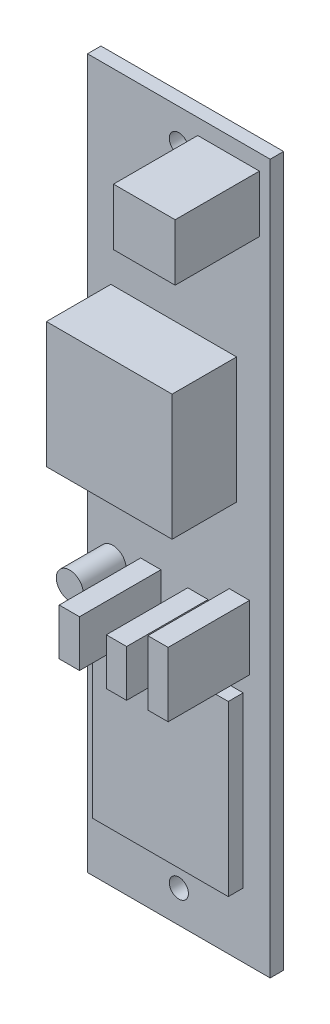
ISO-10303-21;
HEADER;
FILE_DESCRIPTION(('STEP AP214'),'2;1');
FILE_NAME('part.step','',(''),(''),'','','');
FILE_SCHEMA(('AUTOMOTIVE_DESIGN { 1 0 10303 214 1 1 1 1 }'));
ENDSEC;
DATA;
#1=APPLICATION_CONTEXT('core data for automotive mechanical design processes');
#2=APPLICATION_PROTOCOL_DEFINITION('international standard','automotive_design',2000,#1);
#3=PRODUCT_CONTEXT('',#1,'mechanical');
#4=PRODUCT('Part','Part','',(#3));
#5=PRODUCT_RELATED_PRODUCT_CATEGORY('part','',(#4));
#6=PRODUCT_DEFINITION_FORMATION('','',#4);
#7=PRODUCT_DEFINITION_CONTEXT('part definition',#1,'design');
#8=PRODUCT_DEFINITION('design','',#6,#7);
#9=PRODUCT_DEFINITION_SHAPE('','',#8);
#10=(LENGTH_UNIT() NAMED_UNIT(*) SI_UNIT(.MILLI.,.METRE.));
#11=(NAMED_UNIT(*) PLANE_ANGLE_UNIT() SI_UNIT($,.RADIAN.));
#12=(NAMED_UNIT(*) SI_UNIT($,.STERADIAN.) SOLID_ANGLE_UNIT());
#13=UNCERTAINTY_MEASURE_WITH_UNIT(LENGTH_MEASURE(1.E-05),#10,'distance_accuracy_value','');
#14=(GEOMETRIC_REPRESENTATION_CONTEXT(3) GLOBAL_UNCERTAINTY_ASSIGNED_CONTEXT((#13)) GLOBAL_UNIT_ASSIGNED_CONTEXT((#10,
#11,#12)) REPRESENTATION_CONTEXT('',''));
#15=CARTESIAN_POINT('',(0.,0.,0.));
#16=DIRECTION('',(0.,0.,1.));
#17=DIRECTION('',(1.,0.,0.));
#18=AXIS2_PLACEMENT_3D('',#15,#16,#17);
#19=CARTESIAN_POINT('',(0.,0.,1.5875));
#20=DIRECTION('',(0.,0.,1.));
#21=DIRECTION('',(1.,0.,0.));
#22=AXIS2_PLACEMENT_3D('',#19,#20,#21);
#23=PLANE('',#22);
#24=CARTESIAN_POINT('',(-7.81625602394342,-8.50009266287089,1.5875));
#25=DIRECTION('',(0.,0.,1.));
#26=DIRECTION('',(1.,0.,0.));
#27=AXIS2_PLACEMENT_3D('',#24,#25,#26);
#28=CIRCLE('',#27,1.5875);
#29=CARTESIAN_POINT('',(-6.22875602394342,-8.50009266287089,1.5875));
#30=VERTEX_POINT('',#29);
#31=EDGE_CURVE('E1154',#30,#30,#28,.T.);
#32=ORIENTED_EDGE('',*,*,#31,.F.);
#33=EDGE_LOOP('',(#32));
#34=FACE_BOUND('',#33,.T.);
#35=DIRECTION('',(1.,0.,0.));
#36=VECTOR('',#35,1.);
#37=CARTESIAN_POINT('',(-3.31638554604767,-6.5702751285927,1.5875));
#38=LINE('',#37,#36);
#39=CARTESIAN_POINT('',(-4.51653554604767,-6.5702751285927,1.5875));
#40=VERTEX_POINT('',#39);
#41=CARTESIAN_POINT('',(-2.11623554604767,-6.5702751285927,1.5875));
#42=VERTEX_POINT('',#41);
#43=EDGE_CURVE('E286',#40,#42,#38,.T.);
#44=ORIENTED_EDGE('',*,*,#43,.T.);
#45=DIRECTION('',(0.,-1.,0.));
#46=VECTOR('',#45,1.);
#47=CARTESIAN_POINT('',(-2.11623554604767,-9.32617512859269,1.5875));
#48=LINE('',#47,#46);
#49=CARTESIAN_POINT('',(-2.11623554604767,-12.0820751285927,1.5875));
#50=VERTEX_POINT('',#49);
#51=EDGE_CURVE('E271',#42,#50,#48,.T.);
#52=ORIENTED_EDGE('',*,*,#51,.T.);
#53=DIRECTION('',(1.,0.,0.));
#54=VECTOR('',#53,1.);
#55=CARTESIAN_POINT('',(-3.31638554604767,-12.0820751285927,1.5875));
#56=LINE('',#55,#54);
#57=CARTESIAN_POINT('',(-4.51653554604767,-12.0820751285927,1.5875));
#58=VERTEX_POINT('',#57);
#59=EDGE_CURVE('E51',#58,#50,#56,.T.);
#60=ORIENTED_EDGE('',*,*,#59,.F.);
#61=DIRECTION('',(0.,-1.,0.));
#62=VECTOR('',#61,1.);
#63=CARTESIAN_POINT('',(-4.51653554604767,-9.3261751285927,1.5875));
#64=LINE('',#63,#62);
#65=EDGE_CURVE('E43',#40,#58,#64,.T.);
#66=ORIENTED_EDGE('',*,*,#65,.F.);
#67=EDGE_LOOP('',(#44,#52,#60,#66));
#68=FACE_BOUND('',#67,.T.);
#69=DIRECTION('',(1.,0.,0.));
#70=VECTOR('',#69,1.);
#71=CARTESIAN_POINT('',(2.25373666249026,-6.83364062989885,1.5875));
#72=LINE('',#71,#70);
#73=CARTESIAN_POINT('',(1.05358666249026,-6.83364062989885,1.5875));
#74=VERTEX_POINT('',#73);
#75=CARTESIAN_POINT('',(3.45388666249026,-6.83364062989885,1.5875));
#76=VERTEX_POINT('',#75);
#77=EDGE_CURVE('E326',#74,#76,#72,.T.);
#78=ORIENTED_EDGE('',*,*,#77,.T.);
#79=DIRECTION('',(0.,-1.,0.));
#80=VECTOR('',#79,1.);
#81=CARTESIAN_POINT('',(3.45388666249026,-9.58954062989885,1.5875));
#82=LINE('',#81,#80);
#83=CARTESIAN_POINT('',(3.45388666249026,-12.3454406298988,1.5875));
#84=VERTEX_POINT('',#83);
#85=EDGE_CURVE('E348',#76,#84,#82,.T.);
#86=ORIENTED_EDGE('',*,*,#85,.T.);
#87=DIRECTION('',(1.,0.,0.));
#88=VECTOR('',#87,1.);
#89=CARTESIAN_POINT('',(2.25373666249026,-12.3454406298988,1.5875));
#90=LINE('',#89,#88);
#91=CARTESIAN_POINT('',(1.05358666249026,-12.3454406298988,1.5875));
#92=VERTEX_POINT('',#91);
#93=EDGE_CURVE('E338',#92,#84,#90,.T.);
#94=ORIENTED_EDGE('',*,*,#93,.F.);
#95=DIRECTION('',(0.,-1.,0.));
#96=VECTOR('',#95,1.);
#97=CARTESIAN_POINT('',(1.05358666249026,-9.58954062989885,1.5875));
#98=LINE('',#97,#96);
#99=EDGE_CURVE('E331',#74,#92,#98,.T.);
#100=ORIENTED_EDGE('',*,*,#99,.F.);
#101=EDGE_LOOP('',(#78,#86,#94,#100));
#102=FACE_BOUND('',#101,.T.);
#103=DIRECTION('',(1.,0.,0.));
#104=VECTOR('',#103,1.);
#105=CARTESIAN_POINT('',(7.15996317727992,-4.4704,1.5875));
#106=LINE('',#105,#104);
#107=CARTESIAN_POINT('',(5.95981317727992,-4.4704,1.5875));
#108=VERTEX_POINT('',#107);
#109=CARTESIAN_POINT('',(8.36011317727992,-4.4704,1.5875));
#110=VERTEX_POINT('',#109);
#111=EDGE_CURVE('E375',#108,#110,#106,.T.);
#112=ORIENTED_EDGE('',*,*,#111,.T.);
#113=DIRECTION('',(0.,-1.,0.));
#114=VECTOR('',#113,1.);
#115=CARTESIAN_POINT('',(8.36011317727992,-8.2804,1.5875));
#116=LINE('',#115,#114);
#117=CARTESIAN_POINT('',(8.36011317727992,-12.0904,1.5875));
#118=VERTEX_POINT('',#117);
#119=EDGE_CURVE('E369',#110,#118,#116,.T.);
#120=ORIENTED_EDGE('',*,*,#119,.T.);
#121=DIRECTION('',(1.,0.,0.));
#122=VECTOR('',#121,1.);
#123=CARTESIAN_POINT('',(7.15996317727992,-12.0904,1.5875));
#124=LINE('',#123,#122);
#125=CARTESIAN_POINT('',(5.95981317727992,-12.0904,1.5875));
#126=VERTEX_POINT('',#125);
#127=EDGE_CURVE('E389',#126,#118,#124,.T.);
#128=ORIENTED_EDGE('',*,*,#127,.F.);
#129=DIRECTION('',(0.,-1.,0.));
#130=VECTOR('',#129,1.);
#131=CARTESIAN_POINT('',(5.95981317727992,-8.2804,1.5875));
#132=LINE('',#131,#130);
#133=EDGE_CURVE('E397',#108,#126,#132,.T.);
#134=ORIENTED_EDGE('',*,*,#133,.F.);
#135=EDGE_LOOP('',(#112,#120,#128,#134));
#136=FACE_BOUND('',#135,.T.);
#137=DIRECTION('',(1.,0.,0.));
#138=VECTOR('',#137,1.);
#139=CARTESIAN_POINT('',(-0.417085014140609,-14.3129007963181,1.5875));
#140=LINE('',#139,#138);
#141=CARTESIAN_POINT('',(-8.44348501414061,-14.3129007963181,1.5875));
#142=VERTEX_POINT('',#141);
#143=CARTESIAN_POINT('',(7.60931498585939,-14.3129007963181,1.5875));
#144=VERTEX_POINT('',#143);
#145=EDGE_CURVE('E408',#142,#144,#140,.T.);
#146=ORIENTED_EDGE('',*,*,#145,.T.);
#147=DIRECTION('',(0.,-1.,0.));
#148=VECTOR('',#147,1.);
#149=CARTESIAN_POINT('',(7.60931498585939,-24.3014507963181,1.5875));
#150=LINE('',#149,#148);
#151=CARTESIAN_POINT('',(7.60931498585939,-34.2900007963181,1.5875));
#152=VERTEX_POINT('',#151);
#153=EDGE_CURVE('E425',#144,#152,#150,.T.);
#154=ORIENTED_EDGE('',*,*,#153,.T.);
#155=DIRECTION('',(1.,0.,0.));
#156=VECTOR('',#155,1.);
#157=CARTESIAN_POINT('',(-0.417085014140604,-34.2900007963181,1.5875));
#158=LINE('',#157,#156);
#159=CARTESIAN_POINT('',(-8.44348501414061,-34.2900007963181,1.5875));
#160=VERTEX_POINT('',#159);
#161=EDGE_CURVE('E983',#160,#152,#158,.T.);
#162=ORIENTED_EDGE('',*,*,#161,.F.);
#163=DIRECTION('',(0.,-1.,0.));
#164=VECTOR('',#163,1.);
#165=CARTESIAN_POINT('',(-8.44348501414061,-24.3014507963181,1.5875));
#166=LINE('',#165,#164);
#167=EDGE_CURVE('E439',#142,#160,#166,.T.);
#168=ORIENTED_EDGE('',*,*,#167,.F.);
#169=EDGE_LOOP('',(#146,#154,#162,#168));
#170=FACE_BOUND('',#169,.T.);
#171=DIRECTION('',(0.,1.,0.));
#172=VECTOR('',#171,1.);
#173=CARTESIAN_POINT('',(-8.03486164659262,12.2554999603033,1.5875));
#174=LINE('',#173,#172);
#175=CARTESIAN_POINT('',(-8.03486164659262,4.82599996030331,1.5875));
#176=VERTEX_POINT('',#175);
#177=CARTESIAN_POINT('',(-8.03486164659262,19.6849999603033,1.5875));
#178=VERTEX_POINT('',#177);
#179=EDGE_CURVE('E447',#176,#178,#174,.T.);
#180=ORIENTED_EDGE('',*,*,#179,.T.);
#181=DIRECTION('',(1.,0.,0.));
#182=VECTOR('',#181,1.);
#183=CARTESIAN_POINT('',(-0.605361646592619,19.6849999603033,1.5875));
#184=LINE('',#183,#182);
#185=CARTESIAN_POINT('',(6.82413835340738,19.6849999603033,1.5875));
#186=VERTEX_POINT('',#185);
#187=EDGE_CURVE('E472',#178,#186,#184,.T.);
#188=ORIENTED_EDGE('',*,*,#187,.T.);
#189=DIRECTION('',(0.,1.,0.));
#190=VECTOR('',#189,1.);
#191=CARTESIAN_POINT('',(6.82413835340738,12.2554999603033,1.5875));
#192=LINE('',#191,#190);
#193=CARTESIAN_POINT('',(6.82413835340738,4.82599996030331,1.5875));
#194=VERTEX_POINT('',#193);
#195=EDGE_CURVE('E460',#194,#186,#192,.T.);
#196=ORIENTED_EDGE('',*,*,#195,.F.);
#197=DIRECTION('',(1.,0.,0.));
#198=VECTOR('',#197,1.);
#199=CARTESIAN_POINT('',(-0.605361646592617,4.82599996030331,1.5875));
#200=LINE('',#199,#198);
#201=EDGE_CURVE('E452',#176,#194,#200,.T.);
#202=ORIENTED_EDGE('',*,*,#201,.F.);
#203=EDGE_LOOP('',(#180,#188,#196,#202));
#204=FACE_BOUND('',#203,.T.);
#205=CARTESIAN_POINT('',(0.,38.1,1.5875));
#206=DIRECTION('',(0.,0.,1.));
#207=DIRECTION('',(1.,0.,0.));
#208=AXIS2_PLACEMENT_3D('',#205,#206,#207);
#209=CIRCLE('',#208,1.1303);
#210=CARTESIAN_POINT('',(1.1303,38.1,1.5875));
#211=VERTEX_POINT('',#210);
#212=EDGE_CURVE('E544',#211,#211,#209,.T.);
#213=ORIENTED_EDGE('',*,*,#212,.F.);
#214=EDGE_LOOP('',(#213));
#215=FACE_BOUND('',#214,.T.);
#216=CARTESIAN_POINT('',(0.,-38.1,1.5875));
#217=DIRECTION('',(0.,0.,1.));
#218=DIRECTION('',(1.,0.,0.));
#219=AXIS2_PLACEMENT_3D('',#216,#217,#218);
#220=CIRCLE('',#219,1.1303);
#221=CARTESIAN_POINT('',(1.1303,-38.1,1.5875));
#222=VERTEX_POINT('',#221);
#223=EDGE_CURVE('E543',#222,#222,#220,.T.);
#224=ORIENTED_EDGE('',*,*,#223,.F.);
#225=EDGE_LOOP('',(#224));
#226=FACE_BOUND('',#225,.T.);
#227=DIRECTION('',(0.,-1.,0.));
#228=VECTOR('',#227,1.);
#229=CARTESIAN_POINT('',(10.795,0.,1.5875));
#230=LINE('',#229,#228);
#231=CARTESIAN_POINT('',(10.795,41.91,1.5875));
#232=VERTEX_POINT('',#231);
#233=CARTESIAN_POINT('',(10.795,-41.91,1.5875));
#234=VERTEX_POINT('',#233);
#235=EDGE_CURVE('E554',#232,#234,#230,.T.);
#236=ORIENTED_EDGE('',*,*,#235,.F.);
#237=DIRECTION('',(-1.,0.,0.));
#238=VECTOR('',#237,1.);
#239=CARTESIAN_POINT('',(0.,41.91,1.5875));
#240=LINE('',#239,#238);
#241=CARTESIAN_POINT('',(-10.795,41.91,1.5875));
#242=VERTEX_POINT('',#241);
#243=EDGE_CURVE('E627',#232,#242,#240,.T.);
#244=ORIENTED_EDGE('',*,*,#243,.T.);
#245=DIRECTION('',(0.,-1.,0.));
#246=VECTOR('',#245,1.);
#247=CARTESIAN_POINT('',(-10.795,0.,1.5875));
#248=LINE('',#247,#246);
#249=CARTESIAN_POINT('',(-10.795,-41.91,1.5875));
#250=VERTEX_POINT('',#249);
#251=EDGE_CURVE('E623',#242,#250,#248,.T.);
#252=ORIENTED_EDGE('',*,*,#251,.T.);
#253=DIRECTION('',(-1.,0.,0.));
#254=VECTOR('',#253,1.);
#255=CARTESIAN_POINT('',(0.,-41.91,1.5875));
#256=LINE('',#255,#254);
#257=EDGE_CURVE('E568',#234,#250,#256,.T.);
#258=ORIENTED_EDGE('',*,*,#257,.F.);
#259=EDGE_LOOP('',(#236,#244,#252,#258));
#260=FACE_BOUND('',#259,.T.);
#261=DIRECTION('',(0.,-1.,0.));
#262=VECTOR('',#261,1.);
#263=CARTESIAN_POINT('',(2.23071803338825,36.7026351508618,1.5875));
#264=LINE('',#263,#262);
#265=CARTESIAN_POINT('',(2.23071803338825,40.0554351508618,1.5875));
#266=VERTEX_POINT('',#265);
#267=CARTESIAN_POINT('',(2.23071803338825,33.3498351508618,1.5875));
#268=VERTEX_POINT('',#267);
#269=EDGE_CURVE('E513',#266,#268,#264,.T.);
#270=ORIENTED_EDGE('',*,*,#269,.F.);
#271=DIRECTION('',(1.,0.,0.));
#272=VECTOR('',#271,1.);
#273=CARTESIAN_POINT('',(5.87561803338826,40.0554351508618,1.5875));
#274=LINE('',#273,#272);
#275=CARTESIAN_POINT('',(9.52051803338826,40.0554351508618,1.5875));
#276=VERTEX_POINT('',#275);
#277=EDGE_CURVE('E492',#266,#276,#274,.T.);
#278=ORIENTED_EDGE('',*,*,#277,.T.);
#279=DIRECTION('',(0.,-1.,0.));
#280=VECTOR('',#279,1.);
#281=CARTESIAN_POINT('',(9.52051803338826,36.7026351508618,1.5875));
#282=LINE('',#281,#280);
#283=CARTESIAN_POINT('',(9.52051803338826,33.3498351508618,1.5875));
#284=VERTEX_POINT('',#283);
#285=EDGE_CURVE('E499',#276,#284,#282,.T.);
#286=ORIENTED_EDGE('',*,*,#285,.T.);
#287=DIRECTION('',(1.,0.,0.));
#288=VECTOR('',#287,1.);
#289=CARTESIAN_POINT('',(5.87561803338826,33.3498351508618,1.5875));
#290=LINE('',#289,#288);
#291=EDGE_CURVE('E522',#268,#284,#290,.T.);
#292=ORIENTED_EDGE('',*,*,#291,.F.);
#293=EDGE_LOOP('',(#270,#278,#286,#292));
#294=FACE_BOUND('',#293,.T.);
#295=ADVANCED_FACE('F20',(#34,#68,#102,#136,#170,#204,#215,#226,#260,#294),#23,.T.);
#296=CARTESIAN_POINT('',(10.795,0.,1.5875));
#297=DIRECTION('',(1.,0.,0.));
#298=DIRECTION('',(0.,1.,0.));
#299=AXIS2_PLACEMENT_3D('',#296,#297,#298);
#300=PLANE('',#299);
#301=DIRECTION('',(0.,-1.,0.));
#302=VECTOR('',#301,1.);
#303=CARTESIAN_POINT('',(10.795,0.,0.));
#304=LINE('',#303,#302);
#305=CARTESIAN_POINT('',(10.795,41.91,0.));
#306=VERTEX_POINT('',#305);
#307=CARTESIAN_POINT('',(10.795,-41.91,0.));
#308=VERTEX_POINT('',#307);
#309=EDGE_CURVE('E562',#306,#308,#304,.T.);
#310=ORIENTED_EDGE('',*,*,#309,.F.);
#311=DIRECTION('',(0.,0.,-1.));
#312=VECTOR('',#311,1.);
#313=CARTESIAN_POINT('',(10.795,41.91,1.5875));
#314=LINE('',#313,#312);
#315=EDGE_CURVE('E12',#232,#306,#314,.T.);
#316=ORIENTED_EDGE('',*,*,#315,.F.);
#317=ORIENTED_EDGE('',*,*,#235,.T.);
#318=DIRECTION('',(0.,0.,-1.));
#319=VECTOR('',#318,1.);
#320=CARTESIAN_POINT('',(10.795,-41.91,1.5875));
#321=LINE('',#320,#319);
#322=EDGE_CURVE('E582',#234,#308,#321,.T.);
#323=ORIENTED_EDGE('',*,*,#322,.T.);
#324=EDGE_LOOP('',(#310,#316,#317,#323));
#325=FACE_BOUND('',#324,.T.);
#326=ADVANCED_FACE('F22',(#325),#300,.T.);
#327=CARTESIAN_POINT('',(0.,41.91,1.5875));
#328=DIRECTION('',(0.,-1.,0.));
#329=DIRECTION('',(0.,0.,-1.));
#330=AXIS2_PLACEMENT_3D('',#327,#328,#329);
#331=PLANE('',#330);
#332=DIRECTION('',(-1.,0.,0.));
#333=VECTOR('',#332,1.);
#334=CARTESIAN_POINT('',(0.,41.91,0.));
#335=LINE('',#334,#333);
#336=CARTESIAN_POINT('',(-10.795,41.91,0.));
#337=VERTEX_POINT('',#336);
#338=EDGE_CURVE('E567',#306,#337,#335,.T.);
#339=ORIENTED_EDGE('',*,*,#338,.T.);
#340=DIRECTION('',(0.,0.,-1.));
#341=VECTOR('',#340,1.);
#342=CARTESIAN_POINT('',(-10.795,41.91,1.5875));
#343=LINE('',#342,#341);
#344=EDGE_CURVE('E30',#242,#337,#343,.T.);
#345=ORIENTED_EDGE('',*,*,#344,.F.);
#346=ORIENTED_EDGE('',*,*,#243,.F.);
#347=ORIENTED_EDGE('',*,*,#315,.T.);
#348=EDGE_LOOP('',(#339,#345,#346,#347));
#349=FACE_BOUND('',#348,.T.);
#350=ADVANCED_FACE('F626',(#349),#331,.F.);
#351=CARTESIAN_POINT('',(-10.795,0.,1.5875));
#352=DIRECTION('',(1.,0.,0.));
#353=DIRECTION('',(0.,1.,0.));
#354=AXIS2_PLACEMENT_3D('',#351,#352,#353);
#355=PLANE('',#354);
#356=DIRECTION('',(0.,-1.,0.));
#357=VECTOR('',#356,1.);
#358=CARTESIAN_POINT('',(-10.795,0.,0.));
#359=LINE('',#358,#357);
#360=CARTESIAN_POINT('',(-10.795,-41.91,0.));
#361=VERTEX_POINT('',#360);
#362=EDGE_CURVE('E573',#337,#361,#359,.T.);
#363=ORIENTED_EDGE('',*,*,#362,.T.);
#364=DIRECTION('',(0.,0.,-1.));
#365=VECTOR('',#364,1.);
#366=CARTESIAN_POINT('',(-10.795,-41.91,1.5875));
#367=LINE('',#366,#365);
#368=EDGE_CURVE('E585',#250,#361,#367,.T.);
#369=ORIENTED_EDGE('',*,*,#368,.F.);
#370=ORIENTED_EDGE('',*,*,#251,.F.);
#371=ORIENTED_EDGE('',*,*,#344,.T.);
#372=EDGE_LOOP('',(#363,#369,#370,#371));
#373=FACE_BOUND('',#372,.T.);
#374=ADVANCED_FACE('F621',(#373),#355,.F.);
#375=CARTESIAN_POINT('',(0.,-41.91,1.5875));
#376=DIRECTION('',(0.,-1.,0.));
#377=DIRECTION('',(0.,0.,-1.));
#378=AXIS2_PLACEMENT_3D('',#375,#376,#377);
#379=PLANE('',#378);
#380=DIRECTION('',(-1.,0.,0.));
#381=VECTOR('',#380,1.);
#382=CARTESIAN_POINT('',(0.,-41.91,0.));
#383=LINE('',#382,#381);
#384=EDGE_CURVE('E577',#308,#361,#383,.T.);
#385=ORIENTED_EDGE('',*,*,#384,.F.);
#386=ORIENTED_EDGE('',*,*,#322,.F.);
#387=ORIENTED_EDGE('',*,*,#257,.T.);
#388=ORIENTED_EDGE('',*,*,#368,.T.);
#389=EDGE_LOOP('',(#385,#386,#387,#388));
#390=FACE_BOUND('',#389,.T.);
#391=ADVANCED_FACE('F606',(#390),#379,.T.);
#392=CARTESIAN_POINT('',(0.,0.,0.));
#393=DIRECTION('',(0.,0.,1.));
#394=DIRECTION('',(1.,0.,0.));
#395=AXIS2_PLACEMENT_3D('',#392,#393,#394);
#396=PLANE('',#395);
#397=CARTESIAN_POINT('',(0.,38.1,0.));
#398=DIRECTION('',(0.,0.,1.));
#399=DIRECTION('',(1.,0.,0.));
#400=AXIS2_PLACEMENT_3D('',#397,#398,#399);
#401=CIRCLE('',#400,1.1303);
#402=CARTESIAN_POINT('',(1.1303,38.1,0.));
#403=VERTEX_POINT('',#402);
#404=EDGE_CURVE('E24',#403,#403,#401,.F.);
#405=ORIENTED_EDGE('',*,*,#404,.F.);
#406=EDGE_LOOP('',(#405));
#407=FACE_BOUND('',#406,.T.);
#408=CARTESIAN_POINT('',(0.,-38.1,0.));
#409=DIRECTION('',(0.,0.,1.));
#410=DIRECTION('',(1.,0.,0.));
#411=AXIS2_PLACEMENT_3D('',#408,#409,#410);
#412=CIRCLE('',#411,1.1303);
#413=CARTESIAN_POINT('',(1.1303,-38.1,0.));
#414=VERTEX_POINT('',#413);
#415=EDGE_CURVE('E549',#414,#414,#412,.F.);
#416=ORIENTED_EDGE('',*,*,#415,.F.);
#417=EDGE_LOOP('',(#416));
#418=FACE_BOUND('',#417,.T.);
#419=ORIENTED_EDGE('',*,*,#309,.T.);
#420=ORIENTED_EDGE('',*,*,#384,.T.);
#421=ORIENTED_EDGE('',*,*,#362,.F.);
#422=ORIENTED_EDGE('',*,*,#338,.F.);
#423=EDGE_LOOP('',(#419,#420,#421,#422));
#424=FACE_BOUND('',#423,.T.);
#425=ADVANCED_FACE('F602',(#407,#418,#424),#396,.F.);
#426=CARTESIAN_POINT('',(0.,-38.1,-85.3225139210553));
#427=DIRECTION('',(0.,0.,1.));
#428=DIRECTION('',(1.,0.,0.));
#429=AXIS2_PLACEMENT_3D('',#426,#427,#428);
#430=CYLINDRICAL_SURFACE('',#429,1.1303);
#431=ORIENTED_EDGE('',*,*,#223,.T.);
#432=EDGE_LOOP('',(#431));
#433=FACE_BOUND('',#432,.T.);
#434=ORIENTED_EDGE('',*,*,#415,.T.);
#435=EDGE_LOOP('',(#434));
#436=FACE_BOUND('',#435,.T.);
#437=ADVANCED_FACE('F605',(#433,#436),#430,.F.);
#438=CARTESIAN_POINT('',(0.,38.1,-85.3225139210553));
#439=DIRECTION('',(0.,0.,1.));
#440=DIRECTION('',(1.,0.,0.));
#441=AXIS2_PLACEMENT_3D('',#438,#439,#440);
#442=CYLINDRICAL_SURFACE('',#441,1.1303);
#443=ORIENTED_EDGE('',*,*,#212,.T.);
#444=EDGE_LOOP('',(#443));
#445=FACE_BOUND('',#444,.T.);
#446=ORIENTED_EDGE('',*,*,#404,.T.);
#447=EDGE_LOOP('',(#446));
#448=FACE_BOUND('',#447,.T.);
#449=ADVANCED_FACE('F600',(#445,#448),#442,.F.);
#450=CARTESIAN_POINT('',(5.87561803338826,40.0554351508618,11.5443));
#451=DIRECTION('',(0.,1.,0.));
#452=DIRECTION('',(0.,0.,1.));
#453=AXIS2_PLACEMENT_3D('',#450,#451,#452);
#454=PLANE('',#453);
#455=ORIENTED_EDGE('',*,*,#277,.F.);
#456=DIRECTION('',(0.,0.,-1.));
#457=VECTOR('',#456,1.);
#458=CARTESIAN_POINT('',(2.23071803338825,40.0554351508618,11.5443));
#459=LINE('',#458,#457);
#460=CARTESIAN_POINT('',(2.23071803338825,40.0554351508618,11.5443));
#461=VERTEX_POINT('',#460);
#462=EDGE_CURVE('E540',#461,#266,#459,.T.);
#463=ORIENTED_EDGE('',*,*,#462,.F.);
#464=DIRECTION('',(1.,0.,0.));
#465=VECTOR('',#464,1.);
#466=CARTESIAN_POINT('',(5.87561803338826,40.0554351508618,11.5443));
#467=LINE('',#466,#465);
#468=CARTESIAN_POINT('',(9.52051803338826,40.0554351508618,11.5443));
#469=VERTEX_POINT('',#468);
#470=EDGE_CURVE('E493',#461,#469,#467,.T.);
#471=ORIENTED_EDGE('',*,*,#470,.T.);
#472=DIRECTION('',(0.,0.,-1.));
#473=VECTOR('',#472,1.);
#474=CARTESIAN_POINT('',(9.52051803338826,40.0554351508618,11.5443));
#475=LINE('',#474,#473);
#476=EDGE_CURVE('E509',#469,#276,#475,.T.);
#477=ORIENTED_EDGE('',*,*,#476,.T.);
#478=EDGE_LOOP('',(#455,#463,#471,#477));
#479=FACE_BOUND('',#478,.T.);
#480=ADVANCED_FACE('F709',(#479),#454,.T.);
#481=CARTESIAN_POINT('',(2.23071803338825,36.7026351508618,11.5443));
#482=DIRECTION('',(1.,0.,0.));
#483=DIRECTION('',(0.,1.,0.));
#484=AXIS2_PLACEMENT_3D('',#481,#482,#483);
#485=PLANE('',#484);
#486=ORIENTED_EDGE('',*,*,#269,.T.);
#487=DIRECTION('',(0.,0.,-1.));
#488=VECTOR('',#487,1.);
#489=CARTESIAN_POINT('',(2.23071803338825,33.3498351508618,11.5443));
#490=LINE('',#489,#488);
#491=CARTESIAN_POINT('',(2.23071803338825,33.3498351508618,11.5443));
#492=VERTEX_POINT('',#491);
#493=EDGE_CURVE('E536',#492,#268,#490,.T.);
#494=ORIENTED_EDGE('',*,*,#493,.F.);
#495=DIRECTION('',(0.,-1.,0.));
#496=VECTOR('',#495,1.);
#497=CARTESIAN_POINT('',(2.23071803338825,36.7026351508618,11.5443));
#498=LINE('',#497,#496);
#499=EDGE_CURVE('E498',#461,#492,#498,.T.);
#500=ORIENTED_EDGE('',*,*,#499,.F.);
#501=ORIENTED_EDGE('',*,*,#462,.T.);
#502=EDGE_LOOP('',(#486,#494,#500,#501));
#503=FACE_BOUND('',#502,.T.);
#504=ADVANCED_FACE('F752',(#503),#485,.F.);
#505=CARTESIAN_POINT('',(5.87561803338826,33.3498351508618,11.5443));
#506=DIRECTION('',(0.,1.,0.));
#507=DIRECTION('',(0.,0.,1.));
#508=AXIS2_PLACEMENT_3D('',#505,#506,#507);
#509=PLANE('',#508);
#510=ORIENTED_EDGE('',*,*,#291,.T.);
#511=DIRECTION('',(0.,0.,-1.));
#512=VECTOR('',#511,1.);
#513=CARTESIAN_POINT('',(9.52051803338826,33.3498351508618,11.5443));
#514=LINE('',#513,#512);
#515=CARTESIAN_POINT('',(9.52051803338826,33.3498351508618,11.5443));
#516=VERTEX_POINT('',#515);
#517=EDGE_CURVE('E532',#516,#284,#514,.T.);
#518=ORIENTED_EDGE('',*,*,#517,.F.);
#519=DIRECTION('',(1.,0.,0.));
#520=VECTOR('',#519,1.);
#521=CARTESIAN_POINT('',(5.87561803338826,33.3498351508618,11.5443));
#522=LINE('',#521,#520);
#523=EDGE_CURVE('E502',#492,#516,#522,.T.);
#524=ORIENTED_EDGE('',*,*,#523,.F.);
#525=ORIENTED_EDGE('',*,*,#493,.T.);
#526=EDGE_LOOP('',(#510,#518,#524,#525));
#527=FACE_BOUND('',#526,.T.);
#528=ADVANCED_FACE('F761',(#527),#509,.F.);
#529=CARTESIAN_POINT('',(9.52051803338826,36.7026351508618,11.5443));
#530=DIRECTION('',(1.,0.,0.));
#531=DIRECTION('',(0.,0.,-1.));
#532=AXIS2_PLACEMENT_3D('',#529,#530,#531);
#533=PLANE('',#532);
#534=ORIENTED_EDGE('',*,*,#285,.F.);
#535=ORIENTED_EDGE('',*,*,#476,.F.);
#536=DIRECTION('',(0.,-1.,0.));
#537=VECTOR('',#536,1.);
#538=CARTESIAN_POINT('',(9.52051803338826,36.7026351508618,11.5443));
#539=LINE('',#538,#537);
#540=EDGE_CURVE('E505',#469,#516,#539,.T.);
#541=ORIENTED_EDGE('',*,*,#540,.T.);
#542=ORIENTED_EDGE('',*,*,#517,.T.);
#543=EDGE_LOOP('',(#534,#535,#541,#542));
#544=FACE_BOUND('',#543,.T.);
#545=ADVANCED_FACE('F770',(#544),#533,.T.);
#546=CARTESIAN_POINT('',(0.,0.,11.5443));
#547=DIRECTION('',(0.,0.,1.));
#548=DIRECTION('',(1.,0.,0.));
#549=AXIS2_PLACEMENT_3D('',#546,#547,#548);
#550=PLANE('',#549);
#551=ORIENTED_EDGE('',*,*,#470,.F.);
#552=ORIENTED_EDGE('',*,*,#499,.T.);
#553=ORIENTED_EDGE('',*,*,#523,.T.);
#554=ORIENTED_EDGE('',*,*,#540,.F.);
#555=EDGE_LOOP('',(#551,#552,#553,#554));
#556=FACE_BOUND('',#555,.T.);
#557=ADVANCED_FACE('F779',(#556),#550,.T.);
#558=CARTESIAN_POINT('',(-8.03486164659262,12.2554999603033,9.2075));
#559=DIRECTION('',(-1.,0.,0.));
#560=DIRECTION('',(0.,-1.,0.));
#561=AXIS2_PLACEMENT_3D('',#558,#559,#560);
#562=PLANE('',#561);
#563=ORIENTED_EDGE('',*,*,#179,.F.);
#564=DIRECTION('',(0.,0.,-1.));
#565=VECTOR('',#564,1.);
#566=CARTESIAN_POINT('',(-8.03486164659262,4.82599996030331,9.2075));
#567=LINE('',#566,#565);
#568=CARTESIAN_POINT('',(-8.03486164659262,4.82599996030331,9.2075));
#569=VERTEX_POINT('',#568);
#570=EDGE_CURVE('E489',#569,#176,#567,.T.);
#571=ORIENTED_EDGE('',*,*,#570,.F.);
#572=DIRECTION('',(0.,1.,0.));
#573=VECTOR('',#572,1.);
#574=CARTESIAN_POINT('',(-8.03486164659262,12.2554999603033,9.2075));
#575=LINE('',#574,#573);
#576=CARTESIAN_POINT('',(-8.03486164659262,19.6849999603033,9.2075));
#577=VERTEX_POINT('',#576);
#578=EDGE_CURVE('E476',#569,#577,#575,.T.);
#579=ORIENTED_EDGE('',*,*,#578,.T.);
#580=DIRECTION('',(0.,0.,-1.));
#581=VECTOR('',#580,1.);
#582=CARTESIAN_POINT('',(-8.03486164659262,19.6849999603033,9.2075));
#583=LINE('',#582,#581);
#584=EDGE_CURVE('E477',#577,#178,#583,.T.);
#585=ORIENTED_EDGE('',*,*,#584,.T.);
#586=EDGE_LOOP('',(#563,#571,#579,#585));
#587=FACE_BOUND('',#586,.T.);
#588=ADVANCED_FACE('F787',(#587),#562,.T.);
#589=CARTESIAN_POINT('',(-0.605361646592617,4.82599996030331,9.2075));
#590=DIRECTION('',(0.,1.,0.));
#591=DIRECTION('',(0.,0.,1.));
#592=AXIS2_PLACEMENT_3D('',#589,#590,#591);
#593=PLANE('',#592);
#594=ORIENTED_EDGE('',*,*,#201,.T.);
#595=DIRECTION('',(0.,0.,-1.));
#596=VECTOR('',#595,1.);
#597=CARTESIAN_POINT('',(6.82413835340738,4.82599996030331,9.2075));
#598=LINE('',#597,#596);
#599=CARTESIAN_POINT('',(6.82413835340738,4.82599996030331,9.2075));
#600=VERTEX_POINT('',#599);
#601=EDGE_CURVE('E485',#600,#194,#598,.T.);
#602=ORIENTED_EDGE('',*,*,#601,.F.);
#603=DIRECTION('',(1.,0.,0.));
#604=VECTOR('',#603,1.);
#605=CARTESIAN_POINT('',(-0.605361646592617,4.82599996030331,9.2075));
#606=LINE('',#605,#604);
#607=EDGE_CURVE('E812',#569,#600,#606,.T.);
#608=ORIENTED_EDGE('',*,*,#607,.F.);
#609=ORIENTED_EDGE('',*,*,#570,.T.);
#610=EDGE_LOOP('',(#594,#602,#608,#609));
#611=FACE_BOUND('',#610,.T.);
#612=ADVANCED_FACE('F840',(#611),#593,.F.);
#613=CARTESIAN_POINT('',(6.82413835340738,12.2554999603033,9.2075));
#614=DIRECTION('',(-1.,0.,0.));
#615=DIRECTION('',(0.,0.,1.));
#616=AXIS2_PLACEMENT_3D('',#613,#614,#615);
#617=PLANE('',#616);
#618=ORIENTED_EDGE('',*,*,#195,.T.);
#619=DIRECTION('',(0.,0.,-1.));
#620=VECTOR('',#619,1.);
#621=CARTESIAN_POINT('',(6.82413835340738,19.6849999603033,9.2075));
#622=LINE('',#621,#620);
#623=CARTESIAN_POINT('',(6.82413835340738,19.6849999603033,9.2075));
#624=VERTEX_POINT('',#623);
#625=EDGE_CURVE('E481',#624,#186,#622,.T.);
#626=ORIENTED_EDGE('',*,*,#625,.F.);
#627=DIRECTION('',(0.,1.,0.));
#628=VECTOR('',#627,1.);
#629=CARTESIAN_POINT('',(6.82413835340738,12.2554999603033,9.2075));
#630=LINE('',#629,#628);
#631=EDGE_CURVE('E824',#600,#624,#630,.T.);
#632=ORIENTED_EDGE('',*,*,#631,.F.);
#633=ORIENTED_EDGE('',*,*,#601,.T.);
#634=EDGE_LOOP('',(#618,#626,#632,#633));
#635=FACE_BOUND('',#634,.T.);
#636=ADVANCED_FACE('F849',(#635),#617,.F.);
#637=CARTESIAN_POINT('',(-0.605361646592619,19.6849999603033,9.2075));
#638=DIRECTION('',(0.,1.,0.));
#639=DIRECTION('',(0.,0.,1.));
#640=AXIS2_PLACEMENT_3D('',#637,#638,#639);
#641=PLANE('',#640);
#642=ORIENTED_EDGE('',*,*,#187,.F.);
#643=ORIENTED_EDGE('',*,*,#584,.F.);
#644=DIRECTION('',(1.,0.,0.));
#645=VECTOR('',#644,1.);
#646=CARTESIAN_POINT('',(-0.605361646592619,19.6849999603033,9.2075));
#647=LINE('',#646,#645);
#648=EDGE_CURVE('E454',#577,#624,#647,.T.);
#649=ORIENTED_EDGE('',*,*,#648,.T.);
#650=ORIENTED_EDGE('',*,*,#625,.T.);
#651=EDGE_LOOP('',(#642,#643,#649,#650));
#652=FACE_BOUND('',#651,.T.);
#653=ADVANCED_FACE('F858',(#652),#641,.T.);
#654=CARTESIAN_POINT('',(0.,0.,9.2075));
#655=DIRECTION('',(0.,0.,1.));
#656=DIRECTION('',(1.,0.,0.));
#657=AXIS2_PLACEMENT_3D('',#654,#655,#656);
#658=PLANE('',#657);
#659=ORIENTED_EDGE('',*,*,#578,.F.);
#660=ORIENTED_EDGE('',*,*,#607,.T.);
#661=ORIENTED_EDGE('',*,*,#631,.T.);
#662=ORIENTED_EDGE('',*,*,#648,.F.);
#663=EDGE_LOOP('',(#659,#660,#661,#662));
#664=FACE_BOUND('',#663,.T.);
#665=ADVANCED_FACE('F867',(#664),#658,.T.);
#666=CARTESIAN_POINT('',(-0.417085014140609,-14.3129007963181,3.3528));
#667=DIRECTION('',(0.,1.,0.));
#668=DIRECTION('',(-1.,0.,0.));
#669=AXIS2_PLACEMENT_3D('',#666,#667,#668);
#670=PLANE('',#669);
#671=ORIENTED_EDGE('',*,*,#145,.F.);
#672=DIRECTION('',(0.,0.,-1.));
#673=VECTOR('',#672,1.);
#674=CARTESIAN_POINT('',(-8.44348501414061,-14.3129007963181,3.3528));
#675=LINE('',#674,#673);
#676=CARTESIAN_POINT('',(-8.44348501414061,-14.3129007963181,3.3528));
#677=VERTEX_POINT('',#676);
#678=EDGE_CURVE('E453',#677,#142,#675,.T.);
#679=ORIENTED_EDGE('',*,*,#678,.F.);
#680=DIRECTION('',(1.,0.,0.));
#681=VECTOR('',#680,1.);
#682=CARTESIAN_POINT('',(-0.417085014140609,-14.3129007963181,3.3528));
#683=LINE('',#682,#681);
#684=CARTESIAN_POINT('',(7.60931498585939,-14.3129007963181,3.3528));
#685=VERTEX_POINT('',#684);
#686=EDGE_CURVE('E419',#677,#685,#683,.T.);
#687=ORIENTED_EDGE('',*,*,#686,.T.);
#688=DIRECTION('',(0.,0.,-1.));
#689=VECTOR('',#688,1.);
#690=CARTESIAN_POINT('',(7.60931498585939,-14.3129007963181,3.3528));
#691=LINE('',#690,#689);
#692=EDGE_CURVE('E435',#685,#144,#691,.T.);
#693=ORIENTED_EDGE('',*,*,#692,.T.);
#694=EDGE_LOOP('',(#671,#679,#687,#693));
#695=FACE_BOUND('',#694,.T.);
#696=ADVANCED_FACE('F875',(#695),#670,.T.);
#697=CARTESIAN_POINT('',(-8.44348501414061,-24.3014507963181,3.3528));
#698=DIRECTION('',(1.,0.,0.));
#699=DIRECTION('',(0.,1.,0.));
#700=AXIS2_PLACEMENT_3D('',#697,#698,#699);
#701=PLANE('',#700);
#702=ORIENTED_EDGE('',*,*,#167,.T.);
#703=DIRECTION('',(0.,0.,-1.));
#704=VECTOR('',#703,1.);
#705=CARTESIAN_POINT('',(-8.44348501414061,-34.2900007963181,3.3528));
#706=LINE('',#705,#704);
#707=CARTESIAN_POINT('',(-8.44348501414061,-34.2900007963181,3.3528));
#708=VERTEX_POINT('',#707);
#709=EDGE_CURVE('E910',#708,#160,#706,.T.);
#710=ORIENTED_EDGE('',*,*,#709,.F.);
#711=DIRECTION('',(0.,-1.,0.));
#712=VECTOR('',#711,1.);
#713=CARTESIAN_POINT('',(-8.44348501414061,-24.3014507963181,3.3528));
#714=LINE('',#713,#712);
#715=EDGE_CURVE('E424',#677,#708,#714,.T.);
#716=ORIENTED_EDGE('',*,*,#715,.F.);
#717=ORIENTED_EDGE('',*,*,#678,.T.);
#718=EDGE_LOOP('',(#702,#710,#716,#717));
#719=FACE_BOUND('',#718,.T.);
#720=ADVANCED_FACE('F934',(#719),#701,.F.);
#721=CARTESIAN_POINT('',(-0.417085014140604,-34.2900007963181,3.3528));
#722=DIRECTION('',(0.,1.,0.));
#723=DIRECTION('',(0.,0.,1.));
#724=AXIS2_PLACEMENT_3D('',#721,#722,#723);
#725=PLANE('',#724);
#726=ORIENTED_EDGE('',*,*,#161,.T.);
#727=DIRECTION('',(0.,0.,-1.));
#728=VECTOR('',#727,1.);
#729=CARTESIAN_POINT('',(7.60931498585939,-34.2900007963181,3.3528));
#730=LINE('',#729,#728);
#731=CARTESIAN_POINT('',(7.60931498585939,-34.2900007963181,3.3528));
#732=VERTEX_POINT('',#731);
#733=EDGE_CURVE('E904',#732,#152,#730,.T.);
#734=ORIENTED_EDGE('',*,*,#733,.F.);
#735=DIRECTION('',(1.,0.,0.));
#736=VECTOR('',#735,1.);
#737=CARTESIAN_POINT('',(-0.417085014140604,-34.2900007963181,3.3528));
#738=LINE('',#737,#736);
#739=EDGE_CURVE('E428',#708,#732,#738,.T.);
#740=ORIENTED_EDGE('',*,*,#739,.F.);
#741=ORIENTED_EDGE('',*,*,#709,.T.);
#742=EDGE_LOOP('',(#726,#734,#740,#741));
#743=FACE_BOUND('',#742,.T.);
#744=ADVANCED_FACE('F943',(#743),#725,.F.);
#745=CARTESIAN_POINT('',(7.60931498585939,-24.3014507963181,3.3528));
#746=DIRECTION('',(1.,0.,0.));
#747=DIRECTION('',(0.,1.,0.));
#748=AXIS2_PLACEMENT_3D('',#745,#746,#747);
#749=PLANE('',#748);
#750=ORIENTED_EDGE('',*,*,#153,.F.);
#751=ORIENTED_EDGE('',*,*,#692,.F.);
#752=DIRECTION('',(0.,-1.,0.));
#753=VECTOR('',#752,1.);
#754=CARTESIAN_POINT('',(7.60931498585939,-24.3014507963181,3.3528));
#755=LINE('',#754,#753);
#756=EDGE_CURVE('E431',#685,#732,#755,.T.);
#757=ORIENTED_EDGE('',*,*,#756,.T.);
#758=ORIENTED_EDGE('',*,*,#733,.T.);
#759=EDGE_LOOP('',(#750,#751,#757,#758));
#760=FACE_BOUND('',#759,.T.);
#761=ADVANCED_FACE('F952',(#760),#749,.T.);
#762=CARTESIAN_POINT('',(0.,0.,3.3528));
#763=DIRECTION('',(0.,0.,1.));
#764=DIRECTION('',(1.,0.,0.));
#765=AXIS2_PLACEMENT_3D('',#762,#763,#764);
#766=PLANE('',#765);
#767=ORIENTED_EDGE('',*,*,#686,.F.);
#768=ORIENTED_EDGE('',*,*,#715,.T.);
#769=ORIENTED_EDGE('',*,*,#739,.T.);
#770=ORIENTED_EDGE('',*,*,#756,.F.);
#771=EDGE_LOOP('',(#767,#768,#769,#770));
#772=FACE_BOUND('',#771,.T.);
#773=ADVANCED_FACE('F961',(#772),#766,.T.);
#774=CARTESIAN_POINT('',(7.15996317727992,-4.4704,11.2141));
#775=DIRECTION('',(0.,1.,0.));
#776=DIRECTION('',(0.,0.,1.));
#777=AXIS2_PLACEMENT_3D('',#774,#775,#776);
#778=PLANE('',#777);
#779=ORIENTED_EDGE('',*,*,#111,.F.);
#780=DIRECTION('',(0.,0.,-1.));
#781=VECTOR('',#780,1.);
#782=CARTESIAN_POINT('',(5.95981317727992,-4.4704,11.2141));
#783=LINE('',#782,#781);
#784=CARTESIAN_POINT('',(5.95981317727992,-4.4704,11.2141));
#785=VERTEX_POINT('',#784);
#786=EDGE_CURVE('E404',#785,#108,#783,.T.);
#787=ORIENTED_EDGE('',*,*,#786,.F.);
#788=DIRECTION('',(1.,0.,0.));
#789=VECTOR('',#788,1.);
#790=CARTESIAN_POINT('',(7.15996317727992,-4.4704,11.2141));
#791=LINE('',#790,#789);
#792=CARTESIAN_POINT('',(8.36011317727992,-4.4704,11.2141));
#793=VERTEX_POINT('',#792);
#794=EDGE_CURVE('E380',#785,#793,#791,.T.);
#795=ORIENTED_EDGE('',*,*,#794,.T.);
#796=DIRECTION('',(0.,0.,-1.));
#797=VECTOR('',#796,1.);
#798=CARTESIAN_POINT('',(8.36011317727992,-4.4704,11.2141));
#799=LINE('',#798,#797);
#800=EDGE_CURVE('E385',#793,#110,#799,.T.);
#801=ORIENTED_EDGE('',*,*,#800,.T.);
#802=EDGE_LOOP('',(#779,#787,#795,#801));
#803=FACE_BOUND('',#802,.T.);
#804=ADVANCED_FACE('F969',(#803),#778,.T.);
#805=CARTESIAN_POINT('',(5.95981317727992,-8.2804,11.2141));
#806=DIRECTION('',(1.,0.,0.));
#807=DIRECTION('',(0.,0.,-1.));
#808=AXIS2_PLACEMENT_3D('',#805,#806,#807);
#809=PLANE('',#808);
#810=ORIENTED_EDGE('',*,*,#133,.T.);
#811=DIRECTION('',(0.,0.,-1.));
#812=VECTOR('',#811,1.);
#813=CARTESIAN_POINT('',(5.95981317727992,-12.0904,11.2141));
#814=LINE('',#813,#812);
#815=CARTESIAN_POINT('',(5.95981317727992,-12.0904,11.2141));
#816=VERTEX_POINT('',#815);
#817=EDGE_CURVE('E409',#816,#126,#814,.T.);
#818=ORIENTED_EDGE('',*,*,#817,.F.);
#819=DIRECTION('',(0.,-1.,0.));
#820=VECTOR('',#819,1.);
#821=CARTESIAN_POINT('',(5.95981317727992,-8.2804,11.2141));
#822=LINE('',#821,#820);
#823=EDGE_CURVE('E378',#785,#816,#822,.T.);
#824=ORIENTED_EDGE('',*,*,#823,.F.);
#825=ORIENTED_EDGE('',*,*,#786,.T.);
#826=EDGE_LOOP('',(#810,#818,#824,#825));
#827=FACE_BOUND('',#826,.T.);
#828=ADVANCED_FACE('F1017',(#827),#809,.F.);
#829=CARTESIAN_POINT('',(7.15996317727992,-12.0904,11.2141));
#830=DIRECTION('',(0.,1.,0.));
#831=DIRECTION('',(0.,0.,1.));
#832=AXIS2_PLACEMENT_3D('',#829,#830,#831);
#833=PLANE('',#832);
#834=ORIENTED_EDGE('',*,*,#127,.T.);
#835=DIRECTION('',(0.,0.,-1.));
#836=VECTOR('',#835,1.);
#837=CARTESIAN_POINT('',(8.36011317727992,-12.0904,11.2141));
#838=LINE('',#837,#836);
#839=CARTESIAN_POINT('',(8.36011317727992,-12.0904,11.2141));
#840=VERTEX_POINT('',#839);
#841=EDGE_CURVE('E413',#840,#118,#838,.T.);
#842=ORIENTED_EDGE('',*,*,#841,.F.);
#843=DIRECTION('',(1.,0.,0.));
#844=VECTOR('',#843,1.);
#845=CARTESIAN_POINT('',(7.15996317727992,-12.0904,11.2141));
#846=LINE('',#845,#844);
#847=EDGE_CURVE('E374',#816,#840,#846,.T.);
#848=ORIENTED_EDGE('',*,*,#847,.F.);
#849=ORIENTED_EDGE('',*,*,#817,.T.);
#850=EDGE_LOOP('',(#834,#842,#848,#849));
#851=FACE_BOUND('',#850,.T.);
#852=ADVANCED_FACE('F1026',(#851),#833,.F.);
#853=CARTESIAN_POINT('',(8.36011317727992,-8.2804,11.2141));
#854=DIRECTION('',(1.,0.,0.));
#855=DIRECTION('',(0.,0.,-1.));
#856=AXIS2_PLACEMENT_3D('',#853,#854,#855);
#857=PLANE('',#856);
#858=ORIENTED_EDGE('',*,*,#119,.F.);
#859=ORIENTED_EDGE('',*,*,#800,.F.);
#860=DIRECTION('',(0.,-1.,0.));
#861=VECTOR('',#860,1.);
#862=CARTESIAN_POINT('',(8.36011317727992,-8.2804,11.2141));
#863=LINE('',#862,#861);
#864=EDGE_CURVE('E370',#793,#840,#863,.T.);
#865=ORIENTED_EDGE('',*,*,#864,.T.);
#866=ORIENTED_EDGE('',*,*,#841,.T.);
#867=EDGE_LOOP('',(#858,#859,#865,#866));
#868=FACE_BOUND('',#867,.T.);
#869=ADVANCED_FACE('F1035',(#868),#857,.T.);
#870=CARTESIAN_POINT('',(0.,0.,11.2141));
#871=DIRECTION('',(0.,0.,1.));
#872=DIRECTION('',(1.,0.,0.));
#873=AXIS2_PLACEMENT_3D('',#870,#871,#872);
#874=PLANE('',#873);
#875=ORIENTED_EDGE('',*,*,#794,.F.);
#876=ORIENTED_EDGE('',*,*,#823,.T.);
#877=ORIENTED_EDGE('',*,*,#847,.T.);
#878=ORIENTED_EDGE('',*,*,#864,.F.);
#879=EDGE_LOOP('',(#875,#876,#877,#878));
#880=FACE_BOUND('',#879,.T.);
#881=ADVANCED_FACE('F1044',(#880),#874,.T.);
#882=CARTESIAN_POINT('',(2.25373666249026,-6.83364062989885,11.2141));
#883=DIRECTION('',(0.,1.,0.));
#884=DIRECTION('',(0.,0.,1.));
#885=AXIS2_PLACEMENT_3D('',#882,#883,#884);
#886=PLANE('',#885);
#887=ORIENTED_EDGE('',*,*,#77,.F.);
#888=DIRECTION('',(0.,0.,-1.));
#889=VECTOR('',#888,1.);
#890=CARTESIAN_POINT('',(1.05358666249026,-6.83364062989885,11.2141));
#891=LINE('',#890,#889);
#892=CARTESIAN_POINT('',(1.05358666249026,-6.83364062989885,11.2141));
#893=VERTEX_POINT('',#892);
#894=EDGE_CURVE('E365',#893,#74,#891,.T.);
#895=ORIENTED_EDGE('',*,*,#894,.F.);
#896=DIRECTION('',(1.,0.,0.));
#897=VECTOR('',#896,1.);
#898=CARTESIAN_POINT('',(2.25373666249026,-6.83364062989885,11.2141));
#899=LINE('',#898,#897);
#900=CARTESIAN_POINT('',(3.45388666249026,-6.83364062989885,11.2141));
#901=VERTEX_POINT('',#900);
#902=EDGE_CURVE('E352',#893,#901,#899,.T.);
#903=ORIENTED_EDGE('',*,*,#902,.T.);
#904=DIRECTION('',(0.,0.,-1.));
#905=VECTOR('',#904,1.);
#906=CARTESIAN_POINT('',(3.45388666249026,-6.83364062989885,11.2141));
#907=LINE('',#906,#905);
#908=EDGE_CURVE('E353',#901,#76,#907,.T.);
#909=ORIENTED_EDGE('',*,*,#908,.T.);
#910=EDGE_LOOP('',(#887,#895,#903,#909));
#911=FACE_BOUND('',#910,.T.);
#912=ADVANCED_FACE('F1053',(#911),#886,.T.);
#913=CARTESIAN_POINT('',(1.05358666249026,-9.58954062989885,11.2141));
#914=DIRECTION('',(1.,0.,0.));
#915=DIRECTION('',(0.,1.,0.));
#916=AXIS2_PLACEMENT_3D('',#913,#914,#915);
#917=PLANE('',#916);
#918=ORIENTED_EDGE('',*,*,#99,.T.);
#919=DIRECTION('',(0.,0.,-1.));
#920=VECTOR('',#919,1.);
#921=CARTESIAN_POINT('',(1.05358666249026,-12.3454406298988,11.2141));
#922=LINE('',#921,#920);
#923=CARTESIAN_POINT('',(1.05358666249026,-12.3454406298988,11.2141));
#924=VERTEX_POINT('',#923);
#925=EDGE_CURVE('E361',#924,#92,#922,.T.);
#926=ORIENTED_EDGE('',*,*,#925,.F.);
#927=DIRECTION('',(0.,-1.,0.));
#928=VECTOR('',#927,1.);
#929=CARTESIAN_POINT('',(1.05358666249026,-9.58954062989885,11.2141));
#930=LINE('',#929,#928);
#931=EDGE_CURVE('E1063',#893,#924,#930,.T.);
#932=ORIENTED_EDGE('',*,*,#931,.F.);
#933=ORIENTED_EDGE('',*,*,#894,.T.);
#934=EDGE_LOOP('',(#918,#926,#932,#933));
#935=FACE_BOUND('',#934,.T.);
#936=ADVANCED_FACE('F1091',(#935),#917,.F.);
#937=CARTESIAN_POINT('',(2.25373666249026,-12.3454406298988,11.2141));
#938=DIRECTION('',(0.,1.,0.));
#939=DIRECTION('',(0.,0.,1.));
#940=AXIS2_PLACEMENT_3D('',#937,#938,#939);
#941=PLANE('',#940);
#942=ORIENTED_EDGE('',*,*,#93,.T.);
#943=DIRECTION('',(0.,0.,-1.));
#944=VECTOR('',#943,1.);
#945=CARTESIAN_POINT('',(3.45388666249026,-12.3454406298988,11.2141));
#946=LINE('',#945,#944);
#947=CARTESIAN_POINT('',(3.45388666249026,-12.3454406298988,11.2141));
#948=VERTEX_POINT('',#947);
#949=EDGE_CURVE('E357',#948,#84,#946,.T.);
#950=ORIENTED_EDGE('',*,*,#949,.F.);
#951=DIRECTION('',(1.,0.,0.));
#952=VECTOR('',#951,1.);
#953=CARTESIAN_POINT('',(2.25373666249026,-12.3454406298988,11.2141));
#954=LINE('',#953,#952);
#955=EDGE_CURVE('E1075',#924,#948,#954,.T.);
#956=ORIENTED_EDGE('',*,*,#955,.F.);
#957=ORIENTED_EDGE('',*,*,#925,.T.);
#958=EDGE_LOOP('',(#942,#950,#956,#957));
#959=FACE_BOUND('',#958,.T.);
#960=ADVANCED_FACE('F1100',(#959),#941,.F.);
#961=CARTESIAN_POINT('',(3.45388666249026,-9.58954062989885,11.2141));
#962=DIRECTION('',(1.,0.,0.));
#963=DIRECTION('',(0.,0.,-1.));
#964=AXIS2_PLACEMENT_3D('',#961,#962,#963);
#965=PLANE('',#964);
#966=ORIENTED_EDGE('',*,*,#85,.F.);
#967=ORIENTED_EDGE('',*,*,#908,.F.);
#968=DIRECTION('',(0.,-1.,0.));
#969=VECTOR('',#968,1.);
#970=CARTESIAN_POINT('',(3.45388666249026,-9.58954062989885,11.2141));
#971=LINE('',#970,#969);
#972=EDGE_CURVE('E332',#901,#948,#971,.T.);
#973=ORIENTED_EDGE('',*,*,#972,.T.);
#974=ORIENTED_EDGE('',*,*,#949,.T.);
#975=EDGE_LOOP('',(#966,#967,#973,#974));
#976=FACE_BOUND('',#975,.T.);
#977=ADVANCED_FACE('F1109',(#976),#965,.T.);
#978=CARTESIAN_POINT('',(0.,0.,11.2141));
#979=DIRECTION('',(0.,0.,1.));
#980=DIRECTION('',(1.,0.,0.));
#981=AXIS2_PLACEMENT_3D('',#978,#979,#980);
#982=PLANE('',#981);
#983=ORIENTED_EDGE('',*,*,#902,.F.);
#984=ORIENTED_EDGE('',*,*,#931,.T.);
#985=ORIENTED_EDGE('',*,*,#955,.T.);
#986=ORIENTED_EDGE('',*,*,#972,.F.);
#987=EDGE_LOOP('',(#983,#984,#985,#986));
#988=FACE_BOUND('',#987,.T.);
#989=ADVANCED_FACE('F1118',(#988),#982,.T.);
#990=CARTESIAN_POINT('',(-3.31638554604767,-6.5702751285927,11.2141));
#991=DIRECTION('',(0.,1.,0.));
#992=DIRECTION('',(0.,0.,1.));
#993=AXIS2_PLACEMENT_3D('',#990,#991,#992);
#994=PLANE('',#993);
#995=ORIENTED_EDGE('',*,*,#43,.F.);
#996=DIRECTION('',(0.,0.,-1.));
#997=VECTOR('',#996,1.);
#998=CARTESIAN_POINT('',(-4.51653554604767,-6.5702751285927,11.2141));
#999=LINE('',#998,#997);
#1000=CARTESIAN_POINT('',(-4.51653554604767,-6.5702751285927,11.2141));
#1001=VERTEX_POINT('',#1000);
#1002=EDGE_CURVE('E289',#1001,#40,#999,.T.);
#1003=ORIENTED_EDGE('',*,*,#1002,.F.);
#1004=DIRECTION('',(1.,0.,0.));
#1005=VECTOR('',#1004,1.);
#1006=CARTESIAN_POINT('',(-3.31638554604767,-6.5702751285927,11.2141));
#1007=LINE('',#1006,#1005);
#1008=CARTESIAN_POINT('',(-2.11623554604767,-6.5702751285927,11.2141));
#1009=VERTEX_POINT('',#1008);
#1010=EDGE_CURVE('E277',#1001,#1009,#1007,.T.);
#1011=ORIENTED_EDGE('',*,*,#1010,.T.);
#1012=DIRECTION('',(0.,0.,-1.));
#1013=VECTOR('',#1012,1.);
#1014=CARTESIAN_POINT('',(-2.11623554604767,-6.5702751285927,11.2141));
#1015=LINE('',#1014,#1013);
#1016=EDGE_CURVE('E266',#1009,#42,#1015,.T.);
#1017=ORIENTED_EDGE('',*,*,#1016,.T.);
#1018=EDGE_LOOP('',(#995,#1003,#1011,#1017));
#1019=FACE_BOUND('',#1018,.T.);
#1020=ADVANCED_FACE('F288',(#1019),#994,.T.);
#1021=CARTESIAN_POINT('',(-4.51653554604767,-9.3261751285927,11.2141));
#1022=DIRECTION('',(1.,0.,0.));
#1023=DIRECTION('',(0.,0.,-1.));
#1024=AXIS2_PLACEMENT_3D('',#1021,#1022,#1023);
#1025=PLANE('',#1024);
#1026=ORIENTED_EDGE('',*,*,#65,.T.);
#1027=DIRECTION('',(0.,0.,-1.));
#1028=VECTOR('',#1027,1.);
#1029=CARTESIAN_POINT('',(-4.51653554604767,-12.0820751285927,11.2141));
#1030=LINE('',#1029,#1028);
#1031=CARTESIAN_POINT('',(-4.51653554604767,-12.0820751285927,11.2141));
#1032=VERTEX_POINT('',#1031);
#1033=EDGE_CURVE('E1139',#1032,#58,#1030,.T.);
#1034=ORIENTED_EDGE('',*,*,#1033,.F.);
#1035=DIRECTION('',(0.,-1.,0.));
#1036=VECTOR('',#1035,1.);
#1037=CARTESIAN_POINT('',(-4.51653554604767,-9.3261751285927,11.2141));
#1038=LINE('',#1037,#1036);
#1039=EDGE_CURVE('E292',#1001,#1032,#1038,.T.);
#1040=ORIENTED_EDGE('',*,*,#1039,.F.);
#1041=ORIENTED_EDGE('',*,*,#1002,.T.);
#1042=EDGE_LOOP('',(#1026,#1034,#1040,#1041));
#1043=FACE_BOUND('',#1042,.T.);
#1044=ADVANCED_FACE('F1172',(#1043),#1025,.F.);
#1045=CARTESIAN_POINT('',(-3.31638554604767,-12.0820751285927,11.2141));
#1046=DIRECTION('',(0.,1.,0.));
#1047=DIRECTION('',(0.,0.,1.));
#1048=AXIS2_PLACEMENT_3D('',#1045,#1046,#1047);
#1049=PLANE('',#1048);
#1050=ORIENTED_EDGE('',*,*,#59,.T.);
#1051=DIRECTION('',(0.,0.,-1.));
#1052=VECTOR('',#1051,1.);
#1053=CARTESIAN_POINT('',(-2.11623554604767,-12.0820751285927,11.2141));
#1054=LINE('',#1053,#1052);
#1055=CARTESIAN_POINT('',(-2.11623554604767,-12.0820751285927,11.2141));
#1056=VERTEX_POINT('',#1055);
#1057=EDGE_CURVE('E276',#1056,#50,#1054,.T.);
#1058=ORIENTED_EDGE('',*,*,#1057,.F.);
#1059=DIRECTION('',(1.,0.,0.));
#1060=VECTOR('',#1059,1.);
#1061=CARTESIAN_POINT('',(-3.31638554604767,-12.0820751285927,11.2141));
#1062=LINE('',#1061,#1060);
#1063=EDGE_CURVE('E283',#1032,#1056,#1062,.T.);
#1064=ORIENTED_EDGE('',*,*,#1063,.F.);
#1065=ORIENTED_EDGE('',*,*,#1033,.T.);
#1066=EDGE_LOOP('',(#1050,#1058,#1064,#1065));
#1067=FACE_BOUND('',#1066,.T.);
#1068=ADVANCED_FACE('F1169',(#1067),#1049,.F.);
#1069=CARTESIAN_POINT('',(-2.11623554604767,-9.32617512859269,11.2141));
#1070=DIRECTION('',(1.,0.,0.));
#1071=DIRECTION('',(0.,1.,0.));
#1072=AXIS2_PLACEMENT_3D('',#1069,#1070,#1071);
#1073=PLANE('',#1072);
#1074=ORIENTED_EDGE('',*,*,#51,.F.);
#1075=ORIENTED_EDGE('',*,*,#1016,.F.);
#1076=DIRECTION('',(0.,-1.,0.));
#1077=VECTOR('',#1076,1.);
#1078=CARTESIAN_POINT('',(-2.11623554604767,-9.32617512859269,11.2141));
#1079=LINE('',#1078,#1077);
#1080=EDGE_CURVE('E270',#1009,#1056,#1079,.T.);
#1081=ORIENTED_EDGE('',*,*,#1080,.T.);
#1082=ORIENTED_EDGE('',*,*,#1057,.T.);
#1083=EDGE_LOOP('',(#1074,#1075,#1081,#1082));
#1084=FACE_BOUND('',#1083,.T.);
#1085=ADVANCED_FACE('F268',(#1084),#1073,.T.);
#1086=CARTESIAN_POINT('',(0.,0.,11.2141));
#1087=DIRECTION('',(0.,0.,1.));
#1088=DIRECTION('',(1.,0.,0.));
#1089=AXIS2_PLACEMENT_3D('',#1086,#1087,#1088);
#1090=PLANE('',#1089);
#1091=ORIENTED_EDGE('',*,*,#1010,.F.);
#1092=ORIENTED_EDGE('',*,*,#1039,.T.);
#1093=ORIENTED_EDGE('',*,*,#1063,.T.);
#1094=ORIENTED_EDGE('',*,*,#1080,.F.);
#1095=EDGE_LOOP('',(#1091,#1092,#1093,#1094));
#1096=FACE_BOUND('',#1095,.T.);
#1097=ADVANCED_FACE('F281',(#1096),#1090,.T.);
#1098=CARTESIAN_POINT('',(-7.81625602394342,-8.50009266287089,6.6675));
#1099=DIRECTION('',(0.,0.,-1.));
#1100=DIRECTION('',(-1.,0.,0.));
#1101=AXIS2_PLACEMENT_3D('',#1098,#1099,#1100);
#1102=CYLINDRICAL_SURFACE('',#1101,1.5875);
#1103=CARTESIAN_POINT('',(-7.81625602394342,-8.50009266287089,6.6675));
#1104=DIRECTION('',(0.,0.,1.));
#1105=DIRECTION('',(1.,0.,0.));
#1106=AXIS2_PLACEMENT_3D('',#1103,#1104,#1105);
#1107=CIRCLE('',#1106,1.5875);
#1108=CARTESIAN_POINT('',(-6.22875602394342,-8.50009266287089,6.6675));
#1109=VERTEX_POINT('',#1108);
#1110=EDGE_CURVE('E1158',#1109,#1109,#1107,.T.);
#1111=ORIENTED_EDGE('',*,*,#1110,.F.);
#1112=EDGE_LOOP('',(#1111));
#1113=FACE_BOUND('',#1112,.T.);
#1114=ORIENTED_EDGE('',*,*,#31,.T.);
#1115=EDGE_LOOP('',(#1114));
#1116=FACE_BOUND('',#1115,.T.);
#1117=ADVANCED_FACE('F1190',(#1113,#1116),#1102,.T.);
#1118=CARTESIAN_POINT('',(0.,0.,6.6675));
#1119=DIRECTION('',(0.,0.,1.));
#1120=DIRECTION('',(1.,0.,0.));
#1121=AXIS2_PLACEMENT_3D('',#1118,#1119,#1120);
#1122=PLANE('',#1121);
#1123=ORIENTED_EDGE('',*,*,#1110,.T.);
#1124=EDGE_LOOP('',(#1123));
#1125=FACE_BOUND('',#1124,.T.);
#1126=ADVANCED_FACE('F1194',(#1125),#1122,.T.);
#1127=CLOSED_SHELL('',(#295,#326,#350,#374,#391,#425,#437,#449,#480,#504,#528,#545,#557,#588,
#612,#636,#653,#665,#696,#720,#744,#761,#773,#804,#828,#852,#869,#881,#912,#936,#960,#977,#989,
#1020,#1044,#1068,#1085,#1097,#1117,#1126));
#1128=MANIFOLD_SOLID_BREP('B1',#1127);
#1129=ADVANCED_BREP_SHAPE_REPRESENTATION('',(#18,#1128),#14);
#1130=SHAPE_DEFINITION_REPRESENTATION(#9,#1129);
ENDSEC;
END-ISO-10303-21;
